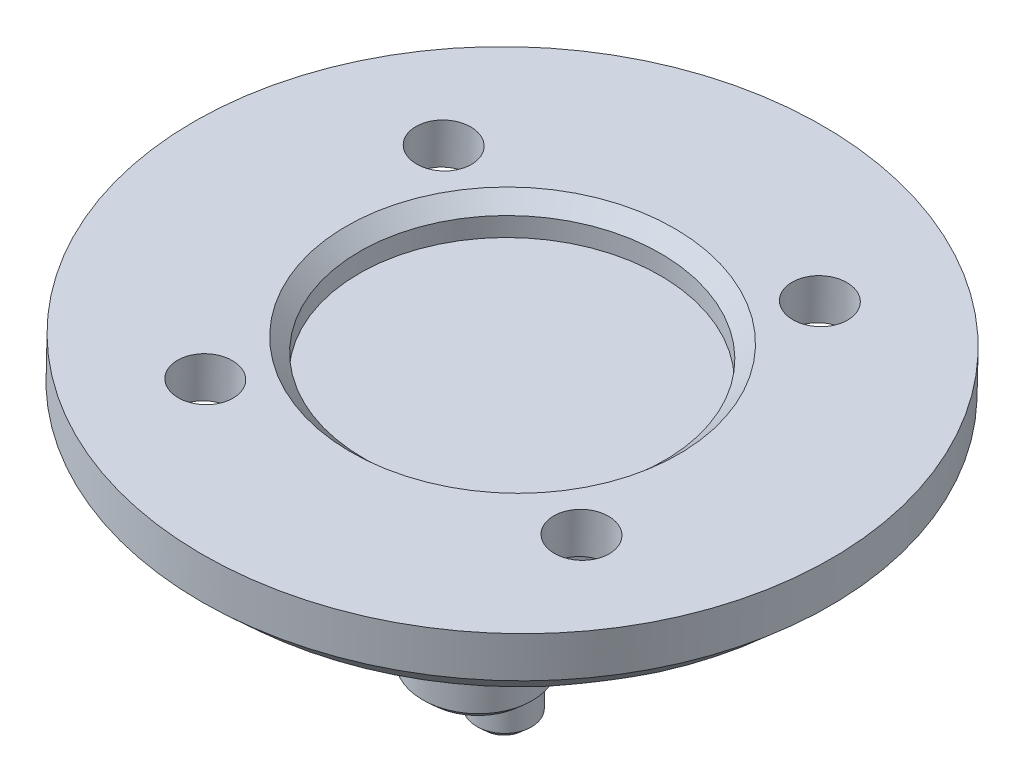
ISO-10303-21;
HEADER;
FILE_DESCRIPTION(('STEP AP214'),'2;1');
FILE_NAME('part.step','',(''),(''),'','','');
FILE_SCHEMA(('AUTOMOTIVE_DESIGN { 1 0 10303 214 1 1 1 1 }'));
ENDSEC;
DATA;
#1=APPLICATION_CONTEXT('core data for automotive mechanical design processes');
#2=APPLICATION_PROTOCOL_DEFINITION('international standard','automotive_design',2000,#1);
#3=PRODUCT_CONTEXT('',#1,'mechanical');
#4=PRODUCT('Part','Part','',(#3));
#5=PRODUCT_RELATED_PRODUCT_CATEGORY('part','',(#4));
#6=PRODUCT_DEFINITION_FORMATION('','',#4);
#7=PRODUCT_DEFINITION_CONTEXT('part definition',#1,'design');
#8=PRODUCT_DEFINITION('design','',#6,#7);
#9=PRODUCT_DEFINITION_SHAPE('','',#8);
#10=(LENGTH_UNIT() NAMED_UNIT(*) SI_UNIT(.MILLI.,.METRE.));
#11=(NAMED_UNIT(*) PLANE_ANGLE_UNIT() SI_UNIT($,.RADIAN.));
#12=(NAMED_UNIT(*) SI_UNIT($,.STERADIAN.) SOLID_ANGLE_UNIT());
#13=UNCERTAINTY_MEASURE_WITH_UNIT(LENGTH_MEASURE(1.E-05),#10,'distance_accuracy_value','');
#14=(GEOMETRIC_REPRESENTATION_CONTEXT(3) GLOBAL_UNCERTAINTY_ASSIGNED_CONTEXT((#13)) GLOBAL_UNIT_ASSIGNED_CONTEXT((#10,
#11,#12)) REPRESENTATION_CONTEXT('',''));
#15=CARTESIAN_POINT('',(0.,0.,0.));
#16=DIRECTION('',(0.,0.,1.));
#17=DIRECTION('',(1.,0.,0.));
#18=AXIS2_PLACEMENT_3D('',#15,#16,#17);
#19=CARTESIAN_POINT('',(-133.548619993604,39.5282636262361,-33.4947766806938));
#20=DIRECTION('',(0.0599731403615461,0.997627727298565,0.0337955642100255));
#21=DIRECTION('',(-0.998197931130778,0.0600074185933236,0.));
#22=AXIS2_PLACEMENT_3D('',#19,#20,#21);
#23=CYLINDRICAL_SURFACE('',#22,0.999999999999998);
#24=CARTESIAN_POINT('',(-133.3986871427,42.0223329444825,-33.4102877701687));
#25=DIRECTION('',(-0.0599731403615461,-0.997627727298565,-0.0337955642100255));
#26=DIRECTION('',(0.998197931130778,-0.0600074185933236,0.));
#27=AXIS2_PLACEMENT_3D('',#24,#25,#26);
#28=CIRCLE('',#27,0.999999999999998);
#29=CARTESIAN_POINT('',(-132.400489211569,41.9623255258892,-33.4102877701687));
#30=VERTEX_POINT('',#29);
#31=EDGE_CURVE('E277',#30,#30,#28,.T.);
#32=ORIENTED_EDGE('',*,*,#31,.F.);
#33=EDGE_LOOP('',(#32));
#34=FACE_BOUND('',#33,.T.);
#35=CARTESIAN_POINT('',(-133.488646853242,40.5258913535347,-33.4609811164837));
#36=DIRECTION('',(-0.0599731403615461,-0.997627727298565,-0.0337955642100256));
#37=DIRECTION('',(0.998197931130778,-0.0600074185933236,0.));
#38=AXIS2_PLACEMENT_3D('',#35,#36,#37);
#39=CIRCLE('',#38,0.999999999999998);
#40=CARTESIAN_POINT('',(-132.490448922111,40.4658839349414,-33.4609811164837));
#41=VERTEX_POINT('',#40);
#42=EDGE_CURVE('E280',#41,#41,#39,.T.);
#43=ORIENTED_EDGE('',*,*,#42,.T.);
#44=EDGE_LOOP('',(#43));
#45=FACE_BOUND('',#44,.T.);
#46=ADVANCED_FACE('F44',(#34,#45),#23,.F.);
#47=CARTESIAN_POINT('',(-131.150275607105,39.0208215939743,-22.7714168160039));
#48=DIRECTION('',(0.0599731403615461,0.997627727298565,0.0337955642100255));
#49=DIRECTION('',(-0.998197931130778,0.0600074185933236,0.));
#50=AXIS2_PLACEMENT_3D('',#47,#48,#49);
#51=CYLINDRICAL_SURFACE('',#50,1.00000000000002);
#52=CARTESIAN_POINT('',(-131.000342756201,41.5148909122207,-22.6869279054788));
#53=DIRECTION('',(-0.0599731403615461,-0.997627727298565,-0.0337955642100255));
#54=DIRECTION('',(0.998197931130778,-0.0600074185933236,0.));
#55=AXIS2_PLACEMENT_3D('',#52,#53,#54);
#56=CIRCLE('',#55,1.00000000000002);
#57=CARTESIAN_POINT('',(-130.00214482507,41.4548834936273,-22.6869279054788));
#58=VERTEX_POINT('',#57);
#59=EDGE_CURVE('E371',#58,#58,#56,.T.);
#60=ORIENTED_EDGE('',*,*,#59,.F.);
#61=EDGE_LOOP('',(#60));
#62=FACE_BOUND('',#61,.T.);
#63=CARTESIAN_POINT('',(-131.090302466743,40.0184493212728,-22.7376212517939));
#64=DIRECTION('',(-0.0599731403615461,-0.997627727298565,-0.0337955642100256));
#65=DIRECTION('',(0.998197931130778,-0.0600074185933236,0.));
#66=AXIS2_PLACEMENT_3D('',#63,#64,#65);
#67=CIRCLE('',#66,1.00000000000002);
#68=CARTESIAN_POINT('',(-130.092104535612,39.9584419026795,-22.7376212517939));
#69=VERTEX_POINT('',#68);
#70=EDGE_CURVE('E358',#69,#69,#67,.T.);
#71=ORIENTED_EDGE('',*,*,#70,.T.);
#72=EDGE_LOOP('',(#71));
#73=FACE_BOUND('',#72,.T.);
#74=ADVANCED_FACE('F218',(#62,#73),#51,.F.);
#75=CARTESIAN_POINT('',(-120.435205186505,38.4587614293735,-25.1945045678125));
#76=DIRECTION('',(0.0599731403615461,0.997627727298565,0.0337955642100255));
#77=DIRECTION('',(-0.998197931130778,0.0600074185933236,0.));
#78=AXIS2_PLACEMENT_3D('',#75,#76,#77);
#79=CYLINDRICAL_SURFACE('',#78,0.999999999999995);
#80=CARTESIAN_POINT('',(-120.285272335601,40.9528307476199,-25.1100156572875));
#81=DIRECTION('',(-0.0599731403615461,-0.997627727298565,-0.0337955642100255));
#82=DIRECTION('',(0.998197931130778,-0.0600074185933236,0.));
#83=AXIS2_PLACEMENT_3D('',#80,#81,#82);
#84=CIRCLE('',#83,0.999999999999995);
#85=CARTESIAN_POINT('',(-119.287074404471,40.8928233290266,-25.1100156572875));
#86=VERTEX_POINT('',#85);
#87=EDGE_CURVE('E353',#86,#86,#84,.T.);
#88=ORIENTED_EDGE('',*,*,#87,.F.);
#89=EDGE_LOOP('',(#88));
#90=FACE_BOUND('',#89,.T.);
#91=CARTESIAN_POINT('',(-120.375232046144,39.4563891566721,-25.1607090036025));
#92=DIRECTION('',(-0.0599731403615461,-0.997627727298565,-0.0337955642100256));
#93=DIRECTION('',(0.998197931130778,-0.0600074185933236,0.));
#94=AXIS2_PLACEMENT_3D('',#91,#92,#93);
#95=CIRCLE('',#94,0.999999999999995);
#96=CARTESIAN_POINT('',(-119.377034115013,39.3963817380788,-25.1607090036025));
#97=VERTEX_POINT('',#96);
#98=EDGE_CURVE('E356',#97,#97,#95,.T.);
#99=ORIENTED_EDGE('',*,*,#98,.T.);
#100=EDGE_LOOP('',(#99));
#101=FACE_BOUND('',#100,.T.);
#102=ADVANCED_FACE('F224',(#90,#101),#79,.F.);
#103=CARTESIAN_POINT('',(-122.833549573004,38.9662034616354,-35.9178644325024));
#104=DIRECTION('',(0.0599731403615461,0.997627727298565,0.0337955642100255));
#105=DIRECTION('',(-0.998197931130778,0.0600074185933236,0.));
#106=AXIS2_PLACEMENT_3D('',#103,#104,#105);
#107=CYLINDRICAL_SURFACE('',#106,1.00000000000001);
#108=CARTESIAN_POINT('',(-122.683616722101,41.4602727798818,-35.8333755219774));
#109=DIRECTION('',(-0.0599731403615461,-0.997627727298565,-0.0337955642100255));
#110=DIRECTION('',(0.998197931130778,-0.0600074185933236,0.));
#111=AXIS2_PLACEMENT_3D('',#108,#109,#110);
#112=CIRCLE('',#111,1.00000000000001);
#113=CARTESIAN_POINT('',(-121.68541879097,41.4002653612885,-35.8333755219774));
#114=VERTEX_POINT('',#113);
#115=EDGE_CURVE('E377',#114,#114,#112,.T.);
#116=ORIENTED_EDGE('',*,*,#115,.F.);
#117=EDGE_LOOP('',(#116));
#118=FACE_BOUND('',#117,.T.);
#119=CARTESIAN_POINT('',(-122.773576432643,39.963831188934,-35.8840688682924));
#120=DIRECTION('',(-0.0599731403615461,-0.997627727298565,-0.0337955642100256));
#121=DIRECTION('',(0.998197931130778,-0.0600074185933236,0.));
#122=AXIS2_PLACEMENT_3D('',#119,#120,#121);
#123=CIRCLE('',#122,1.00000000000001);
#124=CARTESIAN_POINT('',(-121.775378501512,39.9038237703407,-35.8840688682924));
#125=VERTEX_POINT('',#124);
#126=EDGE_CURVE('E359',#125,#125,#123,.T.);
#127=ORIENTED_EDGE('',*,*,#126,.T.);
#128=EDGE_LOOP('',(#127));
#129=FACE_BOUND('',#128,.T.);
#130=ADVANCED_FACE('F235',(#118,#129),#107,.F.);
#131=CARTESIAN_POINT('',(-126.991912590055,38.9935125278048,-29.3446406242531));
#132=DIRECTION('',(0.0599731403615461,0.997627727298565,0.0337955642100255));
#133=DIRECTION('',(-0.998197931130778,0.0600074185933236,0.));
#134=AXIS2_PLACEMENT_3D('',#131,#132,#133);
#135=CYLINDRICAL_SURFACE('',#134,5.49999999999998);
#136=CARTESIAN_POINT('',(-126.871966309331,40.988767982402,-29.2770494958331));
#137=DIRECTION('',(-0.0599731403615472,-0.997627727298565,-0.0337955642100224));
#138=DIRECTION('',(0.998197931130778,-0.0600074185933247,0.));
#139=AXIS2_PLACEMENT_3D('',#136,#137,#138);
#140=CIRCLE('',#139,5.49999999999998);
#141=CARTESIAN_POINT('',(-121.381877688112,40.6587271801387,-29.2770494958331));
#142=VERTEX_POINT('',#141);
#143=EDGE_CURVE('E11',#142,#142,#140,.F.);
#144=ORIENTED_EDGE('',*,*,#143,.T.);
#145=EDGE_LOOP('',(#144));
#146=FACE_BOUND('',#145,.T.);
#147=CARTESIAN_POINT('',(-126.913947507584,40.290428573293,-29.3007063907801));
#148=DIRECTION('',(-0.0599731403615461,-0.997627727298565,-0.0337955642100255));
#149=DIRECTION('',(0.998197931130778,-0.0600074185933236,0.));
#150=AXIS2_PLACEMENT_3D('',#147,#148,#149);
#151=CIRCLE('',#150,5.49999999999995);
#152=CARTESIAN_POINT('',(-121.423858886365,39.9603877710297,-29.3007063907801));
#153=VERTEX_POINT('',#152);
#154=EDGE_CURVE('E381',#153,#153,#151,.T.);
#155=ORIENTED_EDGE('',*,*,#154,.T.);
#156=EDGE_LOOP('',(#155));
#157=FACE_BOUND('',#156,.T.);
#158=ADVANCED_FACE('F231',(#146,#157),#135,.F.);
#159=CARTESIAN_POINT('',(-126.991912590055,38.9935125278048,-29.3446406242531));
#160=DIRECTION('',(-0.0599731403615461,-0.997627727298565,-0.0337955642100255));
#161=DIRECTION('',(0.998197931130778,-0.0600074185933236,0.));
#162=AXIS2_PLACEMENT_3D('',#159,#160,#161);
#163=PLANE('',#162);
#164=CARTESIAN_POINT('',(-126.991912590055,38.9935125278048,-29.3446406242531));
#165=DIRECTION('',(-0.0599731403615461,-0.997627727298565,-0.0337955642100255));
#166=DIRECTION('',(0.998197931130778,-0.0600074185933236,0.));
#167=AXIS2_PLACEMENT_3D('',#164,#165,#166);
#168=CIRCLE('',#167,10.5000000000001);
#169=CARTESIAN_POINT('',(-133.783336535661,39.1305485588551,-21.3379070882078));
#170=VERTEX_POINT('',#169);
#171=CARTESIAN_POINT('',(-136.538513882599,39.7134893575336,-33.6567209952387));
#172=VERTEX_POINT('',#171);
#173=EDGE_CURVE('E503',#170,#172,#168,.T.);
#174=ORIENTED_EDGE('',*,*,#173,.T.);
#175=CARTESIAN_POINT('',(-133.548619993604,39.5282636262361,-33.4947766806938));
#176=DIRECTION('',(-0.0599731403615461,-0.997627727298565,-0.0337955642100255));
#177=DIRECTION('',(0.998197931130778,-0.0600074185933236,0.));
#178=AXIS2_PLACEMENT_3D('',#175,#176,#177);
#179=CIRCLE('',#178,3.00000000000001);
#180=CARTESIAN_POINT('',(-134.975020760718,39.7032214860308,-36.1281719413547));
#181=VERTEX_POINT('',#180);
#182=EDGE_CURVE('E453',#172,#181,#179,.F.);
#183=ORIENTED_EDGE('',*,*,#182,.T.);
#184=CARTESIAN_POINT('',(-122.665729626441,39.0575363034352,-38.9117740466265));
#185=VERTEX_POINT('',#184);
#186=EDGE_CURVE('E431',#181,#185,#168,.T.);
#187=ORIENTED_EDGE('',*,*,#186,.T.);
#188=CARTESIAN_POINT('',(-122.833549573005,38.9662034616354,-35.9178644325024));
#189=DIRECTION('',(-0.0599731403615461,-0.997627727298565,-0.0337955642100255));
#190=DIRECTION('',(0.998197931130778,-0.0600074185933236,0.));
#191=AXIS2_PLACEMENT_3D('',#188,#189,#190);
#192=CIRCLE('',#191,3.00000000000002);
#193=CARTESIAN_POINT('',(-120.200488644448,38.8564764967546,-37.3513741602986));
#194=VERTEX_POINT('',#193);
#195=EDGE_CURVE('E443',#185,#194,#192,.F.);
#196=ORIENTED_EDGE('',*,*,#195,.T.);
#197=CARTESIAN_POINT('',(-117.44531129751,38.2735356980761,-25.0325602532675));
#198=VERTEX_POINT('',#197);
#199=EDGE_CURVE('E427',#194,#198,#168,.T.);
#200=ORIENTED_EDGE('',*,*,#199,.T.);
#201=CARTESIAN_POINT('',(-120.435205186505,38.4587614293735,-25.1945045678126));
#202=DIRECTION('',(-0.0599731403615461,-0.997627727298565,-0.0337955642100255));
#203=DIRECTION('',(0.998197931130778,-0.0600074185933236,0.));
#204=AXIS2_PLACEMENT_3D('',#201,#202,#203);
#205=CIRCLE('',#204,2.99999999999999);
#206=CARTESIAN_POINT('',(-119.008804419391,38.2838035695788,-22.5611093071517));
#207=VERTEX_POINT('',#206);
#208=EDGE_CURVE('E446',#198,#207,#205,.F.);
#209=ORIENTED_EDGE('',*,*,#208,.T.);
#210=CARTESIAN_POINT('',(-131.318095553668,38.9294887521745,-19.7775072018799));
#211=VERTEX_POINT('',#210);
#212=EDGE_CURVE('E433',#207,#211,#168,.T.);
#213=ORIENTED_EDGE('',*,*,#212,.T.);
#214=CARTESIAN_POINT('',(-131.150275607105,39.0208215939743,-22.7714168160039));
#215=DIRECTION('',(-0.0599731403615461,-0.997627727298565,-0.0337955642100255));
#216=DIRECTION('',(0.998197931130778,-0.0600074185933236,0.));
#217=AXIS2_PLACEMENT_3D('',#214,#215,#216);
#218=CIRCLE('',#217,3.00000000000001);
#219=EDGE_CURVE('E450',#211,#170,#218,.F.);
#220=ORIENTED_EDGE('',*,*,#219,.T.);
#221=EDGE_LOOP('',(#174,#183,#187,#196,#200,#209,#213,#220));
#222=FACE_BOUND('',#221,.T.);
#223=CARTESIAN_POINT('',(-126.991912590054,38.9596560215857,-28.3452139200939));
#224=DIRECTION('',(-0.0599731403615461,-0.997627727298565,-0.0337955642100256));
#225=DIRECTION('',(0.998197931130778,-0.0600074185933236,0.));
#226=AXIS2_PLACEMENT_3D('',#223,#224,#225);
#227=CIRCLE('',#226,2.99999999999998);
#228=CARTESIAN_POINT('',(-123.997318796662,38.7796337658058,-28.3452139200939));
#229=VERTEX_POINT('',#228);
#230=EDGE_CURVE('E111',#229,#229,#227,.T.);
#231=ORIENTED_EDGE('',*,*,#230,.F.);
#232=EDGE_LOOP('',(#231));
#233=FACE_BOUND('',#232,.T.);
#234=ADVANCED_FACE('F234',(#222,#233),#163,.T.);
#235=CARTESIAN_POINT('',(-126.841979739151,41.4875818460512,-29.2601517137281));
#236=DIRECTION('',(-0.0599731403615461,-0.997627727298565,-0.0337955642100255));
#237=DIRECTION('',(0.998197931130778,-0.0600074185933236,0.));
#238=AXIS2_PLACEMENT_3D('',#235,#236,#237);
#239=PLANE('',#238);
#240=CARTESIAN_POINT('',(-126.841979739151,41.4875818460512,-29.2601517137281));
#241=DIRECTION('',(-0.0599731403615461,-0.997627727298565,-0.0337955642100255));
#242=DIRECTION('',(0.998197931130778,-0.0600074185933236,0.));
#243=AXIS2_PLACEMENT_3D('',#240,#241,#242);
#244=CIRCLE('',#243,5.99999999999999);
#245=CARTESIAN_POINT('',(-120.852792152366,41.1275373344913,-29.2601517137281));
#246=VERTEX_POINT('',#245);
#247=EDGE_CURVE('E54',#246,#246,#244,.T.);
#248=ORIENTED_EDGE('',*,*,#247,.T.);
#249=EDGE_LOOP('',(#248));
#250=FACE_BOUND('',#249,.T.);
#251=CARTESIAN_POINT('',(-126.841979739151,41.4875818460512,-29.2601517137281));
#252=DIRECTION('',(-0.0599731403615461,-0.997627727298565,-0.0337955642100255));
#253=DIRECTION('',(0.998197931130778,-0.0600074185933236,0.));
#254=AXIS2_PLACEMENT_3D('',#251,#252,#253);
#255=CIRCLE('',#254,11.5);
#256=CARTESIAN_POINT('',(-115.362703531147,40.797496532228,-29.2601517137281));
#257=VERTEX_POINT('',#256);
#258=EDGE_CURVE('E270',#257,#257,#255,.T.);
#259=ORIENTED_EDGE('',*,*,#258,.F.);
#260=EDGE_LOOP('',(#259));
#261=FACE_BOUND('',#260,.T.);
#262=ORIENTED_EDGE('',*,*,#31,.T.);
#263=EDGE_LOOP('',(#262));
#264=FACE_BOUND('',#263,.T.);
#265=ORIENTED_EDGE('',*,*,#59,.T.);
#266=EDGE_LOOP('',(#265));
#267=FACE_BOUND('',#266,.T.);
#268=ORIENTED_EDGE('',*,*,#87,.T.);
#269=EDGE_LOOP('',(#268));
#270=FACE_BOUND('',#269,.T.);
#271=ORIENTED_EDGE('',*,*,#115,.T.);
#272=EDGE_LOOP('',(#271));
#273=FACE_BOUND('',#272,.T.);
#274=ADVANCED_FACE('F239',(#250,#261,#264,#267,#270,#273),#239,.F.);
#275=CARTESIAN_POINT('',(-126.991912590055,38.9935125278048,-29.3446406242531));
#276=DIRECTION('',(0.0599731403615461,0.997627727298565,0.0337955642100255));
#277=DIRECTION('',(-0.998197931130778,0.0600074185933236,0.));
#278=AXIS2_PLACEMENT_3D('',#275,#276,#277);
#279=CYLINDRICAL_SURFACE('',#278,11.5);
#280=CARTESIAN_POINT('',(-126.931939449693,39.9911402551034,-29.3108450600431));
#281=DIRECTION('',(-0.0599731403615481,-0.997627727298565,-0.0337955642100264));
#282=DIRECTION('',(0.998197931130778,-0.0600074185933256,0.));
#283=AXIS2_PLACEMENT_3D('',#280,#281,#282);
#284=CIRCLE('',#283,11.5);
#285=CARTESIAN_POINT('',(-115.452663241689,39.3010549412801,-29.3108450600431));
#286=VERTEX_POINT('',#285);
#287=EDGE_CURVE('E435',#286,#286,#284,.F.);
#288=ORIENTED_EDGE('',*,*,#287,.T.);
#289=EDGE_LOOP('',(#288));
#290=FACE_BOUND('',#289,.T.);
#291=ORIENTED_EDGE('',*,*,#258,.T.);
#292=EDGE_LOOP('',(#291));
#293=FACE_BOUND('',#292,.T.);
#294=ADVANCED_FACE('F243',(#290,#293),#279,.T.);
#295=CARTESIAN_POINT('',(-126.913947507584,40.290428573293,-29.3007063907801));
#296=DIRECTION('',(-0.0599731403615461,-0.997627727298565,-0.0337955642100255));
#297=DIRECTION('',(0.998197931130778,-0.0600074185933236,0.));
#298=AXIS2_PLACEMENT_3D('',#295,#296,#297);
#299=PLANE('',#298);
#300=ORIENTED_EDGE('',*,*,#154,.F.);
#301=EDGE_LOOP('',(#300));
#302=FACE_BOUND('',#301,.T.);
#303=ADVANCED_FACE('F246',(#302),#299,.F.);
#304=CARTESIAN_POINT('',(-122.773576432643,39.963831188934,-35.8840688682924));
#305=DIRECTION('',(-0.0599731403615461,-0.997627727298565,-0.0337955642100256));
#306=DIRECTION('',(0.998197931130778,-0.0600074185933236,0.));
#307=AXIS2_PLACEMENT_3D('',#304,#305,#306);
#308=CYLINDRICAL_SURFACE('',#307,2.5);
#309=CARTESIAN_POINT('',(-122.803563002824,39.4650173252847,-35.9009666503974));
#310=DIRECTION('',(-0.0599731403615472,-0.997627727298565,-0.0337955642100294));
#311=DIRECTION('',(0.998197931130778,-0.0600074185933247,0.));
#312=AXIS2_PLACEMENT_3D('',#309,#310,#311);
#313=CIRCLE('',#312,2.5);
#314=CARTESIAN_POINT('',(-120.308068174997,39.3149987788014,-35.9009666503974));
#315=VERTEX_POINT('',#314);
#316=EDGE_CURVE('E469',#315,#315,#313,.T.);
#317=ORIENTED_EDGE('',*,*,#316,.T.);
#318=EDGE_LOOP('',(#317));
#319=FACE_BOUND('',#318,.T.);
#320=CARTESIAN_POINT('',(-122.773576432643,39.963831188934,-35.8840688682924));
#321=DIRECTION('',(-0.0599731403615461,-0.997627727298565,-0.0337955642100256));
#322=DIRECTION('',(0.998197931130778,-0.0600074185933236,0.));
#323=AXIS2_PLACEMENT_3D('',#320,#321,#322);
#324=CIRCLE('',#323,2.5);
#325=CARTESIAN_POINT('',(-120.278081604816,39.8138126424507,-35.8840688682924));
#326=VERTEX_POINT('',#325);
#327=EDGE_CURVE('E389',#326,#326,#324,.T.);
#328=ORIENTED_EDGE('',*,*,#327,.F.);
#329=EDGE_LOOP('',(#328));
#330=FACE_BOUND('',#329,.T.);
#331=ADVANCED_FACE('F328',(#319,#330),#308,.F.);
#332=CARTESIAN_POINT('',(-122.773576432643,39.963831188934,-35.8840688682924));
#333=DIRECTION('',(-0.0599731403615461,-0.997627727298565,-0.0337955642100256));
#334=DIRECTION('',(0.998197931130778,-0.0600074185933236,0.));
#335=AXIS2_PLACEMENT_3D('',#332,#333,#334);
#336=PLANE('',#335);
#337=ORIENTED_EDGE('',*,*,#126,.F.);
#338=EDGE_LOOP('',(#337));
#339=FACE_BOUND('',#338,.T.);
#340=ORIENTED_EDGE('',*,*,#327,.T.);
#341=EDGE_LOOP('',(#340));
#342=FACE_BOUND('',#341,.T.);
#343=ADVANCED_FACE('F323',(#339,#342),#336,.T.);
#344=CARTESIAN_POINT('',(-120.375232046144,39.4563891566721,-25.1607090036025));
#345=DIRECTION('',(-0.0599731403615461,-0.997627727298565,-0.0337955642100256));
#346=DIRECTION('',(0.998197931130778,-0.0600074185933236,0.));
#347=AXIS2_PLACEMENT_3D('',#344,#345,#346);
#348=CYLINDRICAL_SURFACE('',#347,2.49999999999999);
#349=CARTESIAN_POINT('',(-120.405218616324,38.9575752930228,-25.1776067857076));
#350=DIRECTION('',(-0.0599731403615456,-0.997627727298566,-0.0337955642100215));
#351=DIRECTION('',(0.998197931130778,-0.0600074185933231,0.));
#352=AXIS2_PLACEMENT_3D('',#349,#350,#351);
#353=CIRCLE('',#352,2.49999999999999);
#354=CARTESIAN_POINT('',(-117.909723788498,38.8075567465395,-25.1776067857076));
#355=VERTEX_POINT('',#354);
#356=EDGE_CURVE('E467',#355,#355,#353,.T.);
#357=ORIENTED_EDGE('',*,*,#356,.T.);
#358=EDGE_LOOP('',(#357));
#359=FACE_BOUND('',#358,.T.);
#360=CARTESIAN_POINT('',(-120.375232046144,39.4563891566721,-25.1607090036025));
#361=DIRECTION('',(-0.0599731403615461,-0.997627727298565,-0.0337955642100256));
#362=DIRECTION('',(0.998197931130778,-0.0600074185933236,0.));
#363=AXIS2_PLACEMENT_3D('',#360,#361,#362);
#364=CIRCLE('',#363,2.49999999999999);
#365=CARTESIAN_POINT('',(-117.879737218317,39.3063706101888,-25.1607090036025));
#366=VERTEX_POINT('',#365);
#367=EDGE_CURVE('E393',#366,#366,#364,.T.);
#368=ORIENTED_EDGE('',*,*,#367,.F.);
#369=EDGE_LOOP('',(#368));
#370=FACE_BOUND('',#369,.T.);
#371=ADVANCED_FACE('F320',(#359,#370),#348,.F.);
#372=CARTESIAN_POINT('',(-120.375232046144,39.4563891566721,-25.1607090036025));
#373=DIRECTION('',(-0.0599731403615461,-0.997627727298565,-0.0337955642100256));
#374=DIRECTION('',(0.998197931130778,-0.0600074185933236,0.));
#375=AXIS2_PLACEMENT_3D('',#372,#373,#374);
#376=PLANE('',#375);
#377=ORIENTED_EDGE('',*,*,#98,.F.);
#378=EDGE_LOOP('',(#377));
#379=FACE_BOUND('',#378,.T.);
#380=ORIENTED_EDGE('',*,*,#367,.T.);
#381=EDGE_LOOP('',(#380));
#382=FACE_BOUND('',#381,.T.);
#383=ADVANCED_FACE('F314',(#379,#382),#376,.T.);
#384=CARTESIAN_POINT('',(-131.090302466743,40.0184493212728,-22.7376212517938));
#385=DIRECTION('',(-0.0599731403615461,-0.997627727298565,-0.0337955642100256));
#386=DIRECTION('',(0.998197931130778,-0.0600074185933236,0.));
#387=AXIS2_PLACEMENT_3D('',#384,#385,#386);
#388=CYLINDRICAL_SURFACE('',#387,2.50000000000001);
#389=CARTESIAN_POINT('',(-131.120289036924,39.5196354576235,-22.7545190338989));
#390=DIRECTION('',(-0.0599731403615472,-0.997627727298565,-0.0337955642100224));
#391=DIRECTION('',(0.998197931130778,-0.0600074185933247,0.));
#392=AXIS2_PLACEMENT_3D('',#389,#390,#391);
#393=CIRCLE('',#392,2.50000000000001);
#394=CARTESIAN_POINT('',(-128.624794209097,39.3696169111402,-22.7545190338989));
#395=VERTEX_POINT('',#394);
#396=EDGE_CURVE('E470',#395,#395,#393,.T.);
#397=ORIENTED_EDGE('',*,*,#396,.T.);
#398=EDGE_LOOP('',(#397));
#399=FACE_BOUND('',#398,.T.);
#400=CARTESIAN_POINT('',(-131.090302466743,40.0184493212728,-22.7376212517938));
#401=DIRECTION('',(-0.0599731403615461,-0.997627727298565,-0.0337955642100256));
#402=DIRECTION('',(0.998197931130778,-0.0600074185933236,0.));
#403=AXIS2_PLACEMENT_3D('',#400,#401,#402);
#404=CIRCLE('',#403,2.50000000000001);
#405=CARTESIAN_POINT('',(-128.594807638916,39.8684307747895,-22.7376212517938));
#406=VERTEX_POINT('',#405);
#407=EDGE_CURVE('E388',#406,#406,#404,.T.);
#408=ORIENTED_EDGE('',*,*,#407,.F.);
#409=EDGE_LOOP('',(#408));
#410=FACE_BOUND('',#409,.T.);
#411=ADVANCED_FACE('F310',(#399,#410),#388,.F.);
#412=CARTESIAN_POINT('',(-131.090302466743,40.0184493212728,-22.7376212517938));
#413=DIRECTION('',(-0.0599731403615461,-0.997627727298565,-0.0337955642100256));
#414=DIRECTION('',(0.998197931130778,-0.0600074185933236,0.));
#415=AXIS2_PLACEMENT_3D('',#412,#413,#414);
#416=PLANE('',#415);
#417=ORIENTED_EDGE('',*,*,#70,.F.);
#418=EDGE_LOOP('',(#417));
#419=FACE_BOUND('',#418,.T.);
#420=ORIENTED_EDGE('',*,*,#407,.T.);
#421=EDGE_LOOP('',(#420));
#422=FACE_BOUND('',#421,.T.);
#423=ADVANCED_FACE('F313',(#419,#422),#416,.T.);
#424=CARTESIAN_POINT('',(-133.488646853242,40.5258913535347,-33.4609811164837));
#425=DIRECTION('',(-0.0599731403615461,-0.997627727298565,-0.0337955642100256));
#426=DIRECTION('',(0.998197931130778,-0.0600074185933236,0.));
#427=AXIS2_PLACEMENT_3D('',#424,#425,#426);
#428=CYLINDRICAL_SURFACE('',#427,2.49999999999998);
#429=CARTESIAN_POINT('',(-133.518633423423,40.0270774898854,-33.4778788985887));
#430=DIRECTION('',(-0.0599731403615464,-0.997627727298565,-0.0337955642100289));
#431=DIRECTION('',(0.998197931130778,-0.0600074185933239,0.));
#432=AXIS2_PLACEMENT_3D('',#429,#430,#431);
#433=CIRCLE('',#432,2.49999999999998);
#434=CARTESIAN_POINT('',(-131.023138595596,39.8770589434021,-33.4778788985887));
#435=VERTEX_POINT('',#434);
#436=EDGE_CURVE('E439',#435,#435,#433,.T.);
#437=ORIENTED_EDGE('',*,*,#436,.T.);
#438=EDGE_LOOP('',(#437));
#439=FACE_BOUND('',#438,.T.);
#440=CARTESIAN_POINT('',(-133.488646853242,40.5258913535347,-33.4609811164837));
#441=DIRECTION('',(-0.0599731403615461,-0.997627727298565,-0.0337955642100256));
#442=DIRECTION('',(0.998197931130778,-0.0600074185933236,0.));
#443=AXIS2_PLACEMENT_3D('',#440,#441,#442);
#444=CIRCLE('',#443,2.49999999999998);
#445=CARTESIAN_POINT('',(-130.993152025415,40.3758728070514,-33.4609811164837));
#446=VERTEX_POINT('',#445);
#447=EDGE_CURVE('E365',#446,#446,#444,.T.);
#448=ORIENTED_EDGE('',*,*,#447,.F.);
#449=EDGE_LOOP('',(#448));
#450=FACE_BOUND('',#449,.T.);
#451=ADVANCED_FACE('F318',(#439,#450),#428,.F.);
#452=CARTESIAN_POINT('',(-133.488646853242,40.5258913535347,-33.4609811164837));
#453=DIRECTION('',(-0.0599731403615461,-0.997627727298565,-0.0337955642100256));
#454=DIRECTION('',(0.998197931130778,-0.0600074185933236,0.));
#455=AXIS2_PLACEMENT_3D('',#452,#453,#454);
#456=PLANE('',#455);
#457=ORIENTED_EDGE('',*,*,#42,.F.);
#458=EDGE_LOOP('',(#457));
#459=FACE_BOUND('',#458,.T.);
#460=ORIENTED_EDGE('',*,*,#447,.T.);
#461=EDGE_LOOP('',(#460));
#462=FACE_BOUND('',#461,.T.);
#463=ADVANCED_FACE('F303',(#459,#462),#456,.T.);
#464=CARTESIAN_POINT('',(-127.231805151501,34.9691451123915,-28.480396176934));
#465=DIRECTION('',(0.0599731403615461,0.997627727298565,0.0337955642100256));
#466=DIRECTION('',(-0.998197931130778,0.0600074185933236,0.));
#467=AXIS2_PLACEMENT_3D('',#464,#465,#466);
#468=CYLINDRICAL_SURFACE('',#467,2.99999999999998);
#469=CARTESIAN_POINT('',(-127.213813209392,35.268433430581,-28.470257507671));
#470=DIRECTION('',(-0.0599731403615643,-0.997627727298564,-0.0337955642100309));
#471=DIRECTION('',(0.998197931130777,-0.0600074185933418,0.));
#472=AXIS2_PLACEMENT_3D('',#469,#470,#471);
#473=CIRCLE('',#472,2.99999999999998);
#474=CARTESIAN_POINT('',(-124.219219416,35.088411174801,-28.470257507671));
#475=VERTEX_POINT('',#474);
#476=EDGE_CURVE('E120',#475,#475,#473,.F.);
#477=ORIENTED_EDGE('',*,*,#476,.T.);
#478=EDGE_LOOP('',(#477));
#479=FACE_BOUND('',#478,.T.);
#480=ORIENTED_EDGE('',*,*,#230,.T.);
#481=EDGE_LOOP('',(#480));
#482=FACE_BOUND('',#481,.T.);
#483=ADVANCED_FACE('F289',(#479,#482),#468,.T.);
#484=CARTESIAN_POINT('',(-127.231805151501,34.9691451123915,-28.480396176934));
#485=DIRECTION('',(-0.0599731403615461,-0.997627727298565,-0.0337955642100256));
#486=DIRECTION('',(0.998197931130778,-0.0600074185933236,0.));
#487=AXIS2_PLACEMENT_3D('',#484,#485,#486);
#488=PLANE('',#487);
#489=CARTESIAN_POINT('',(-127.231805151505,34.9691451123917,-28.4803961769332));
#490=DIRECTION('',(-0.0599731403615461,-0.997627727298565,-0.0337955642100256));
#491=DIRECTION('',(0.998197931130778,-0.0600074185933236,0.));
#492=AXIS2_PLACEMENT_3D('',#489,#490,#491);
#493=CIRCLE('',#492,2.30042505215082);
#494=CARTESIAN_POINT('',(-124.935525623726,34.8311025433447,-28.4803961769332));
#495=VERTEX_POINT('',#494);
#496=EDGE_CURVE('E406',#495,#495,#493,.T.);
#497=ORIENTED_EDGE('',*,*,#496,.F.);
#498=EDGE_LOOP('',(#497));
#499=FACE_BOUND('',#498,.T.);
#500=CARTESIAN_POINT('',(-127.231805151501,34.9691451123915,-28.480396176934));
#501=DIRECTION('',(-0.0599731403615461,-0.997627727298565,-0.0337955642100256));
#502=DIRECTION('',(0.998197931130778,-0.0600074185933236,0.));
#503=AXIS2_PLACEMENT_3D('',#500,#501,#502);
#504=CIRCLE('',#503,2.70000000000004);
#505=CARTESIAN_POINT('',(-124.536670737447,34.8071250821895,-28.480396176934));
#506=VERTEX_POINT('',#505);
#507=EDGE_CURVE('E274',#506,#506,#504,.T.);
#508=ORIENTED_EDGE('',*,*,#507,.T.);
#509=EDGE_LOOP('',(#508));
#510=FACE_BOUND('',#509,.T.);
#511=ADVANCED_FACE('F295',(#499,#510),#488,.T.);
#512=CARTESIAN_POINT('',(-127.231805151501,34.9691451123915,-28.480396176934));
#513=DIRECTION('',(0.0599731403615643,0.997627727298564,0.0337955642100309));
#514=DIRECTION('',(-0.998197931130777,0.0600074185933418,0.));
#515=AXIS2_PLACEMENT_3D('',#512,#513,#514);
#516=CONICAL_SURFACE('',#515,2.69999999999998,0.785398163397428);
#517=ORIENTED_EDGE('',*,*,#476,.F.);
#518=EDGE_LOOP('',(#517));
#519=FACE_BOUND('',#518,.T.);
#520=ORIENTED_EDGE('',*,*,#507,.F.);
#521=EDGE_LOOP('',(#520));
#522=FACE_BOUND('',#521,.T.);
#523=ADVANCED_FACE('F148',(#519,#522),#516,.T.);
#524=CARTESIAN_POINT('',(-127.711985174489,26.9815542986373,-28.7509832214219));
#525=DIRECTION('',(0.0599731403615461,0.997627727298565,0.0337955642100256));
#526=DIRECTION('',(-0.998197931130778,0.0600074185933236,0.));
#527=AXIS2_PLACEMENT_3D('',#524,#525,#526);
#528=CYLINDRICAL_SURFACE('',#527,2.30042505215082);
#529=CARTESIAN_POINT('',(-127.321764862042,33.4727035215223,-28.5310895232456));
#530=DIRECTION('',(0.0599731403615678,0.997627727298564,0.0337955642100203));
#531=DIRECTION('',(-0.998197931130777,0.0600074185933453,0.));
#532=AXIS2_PLACEMENT_3D('',#529,#530,#531);
#533=CIRCLE('',#532,2.30042505215082);
#534=CARTESIAN_POINT('',(-129.618044389821,33.6107460905693,-28.5310895232456));
#535=VERTEX_POINT('',#534);
#536=EDGE_CURVE('E112',#535,#535,#533,.T.);
#537=ORIENTED_EDGE('',*,*,#536,.T.);
#538=EDGE_LOOP('',(#537));
#539=FACE_BOUND('',#538,.T.);
#540=ORIENTED_EDGE('',*,*,#496,.T.);
#541=EDGE_LOOP('',(#540));
#542=FACE_BOUND('',#541,.T.);
#543=ADVANCED_FACE('F294',(#539,#542),#528,.T.);
#544=CARTESIAN_POINT('',(-127.321764862042,33.4727035215223,-28.5310895232456));
#545=DIRECTION('',(0.0599731403615678,0.997627727298564,0.0337955642100203));
#546=DIRECTION('',(-0.669139725860026,0.015056563154377,0.742984069265249));
#547=AXIS2_PLACEMENT_3D('',#544,#545,#546);
#548=PLANE('',#547);
#549=CARTESIAN_POINT('',(-127.321764862038,33.4727035215221,-28.5310895232464));
#550=DIRECTION('',(0.0599731403615678,0.997627727298564,0.0337955642100203));
#551=DIRECTION('',(-0.998197931130777,0.0600074185933453,0.));
#552=AXIS2_PLACEMENT_3D('',#549,#550,#551);
#553=CIRCLE('',#552,1.99999999999999);
#554=CARTESIAN_POINT('',(-129.3181607243,33.5927183587088,-28.5310895232464));
#555=VERTEX_POINT('',#554);
#556=EDGE_CURVE('E424',#555,#555,#553,.T.);
#557=ORIENTED_EDGE('',*,*,#556,.T.);
#558=EDGE_LOOP('',(#557));
#559=FACE_BOUND('',#558,.T.);
#560=ORIENTED_EDGE('',*,*,#536,.F.);
#561=EDGE_LOOP('',(#560));
#562=FACE_BOUND('',#561,.T.);
#563=ADVANCED_FACE('F260',(#559,#562),#548,.F.);
#564=CARTESIAN_POINT('',(-127.561657423504,29.5160491184694,-29.6656984842514));
#565=DIRECTION('',(-0.0599731403615461,-0.997627727298565,-0.0337955642100256));
#566=DIRECTION('',(0.998197931130778,-0.0600074185933236,0.));
#567=AXIS2_PLACEMENT_3D('',#564,#565,#566);
#568=PLANE('',#567);
#569=CARTESIAN_POINT('',(-127.561657423504,29.5160491184694,-29.6656984842514));
#570=DIRECTION('',(-0.0599731403615461,-0.997627727298565,-0.0337955642100256));
#571=DIRECTION('',(0.998197931130778,-0.0600074185933236,0.));
#572=AXIS2_PLACEMENT_3D('',#569,#570,#571);
#573=CIRCLE('',#572,0.699999999996986);
#574=CARTESIAN_POINT('',(-126.862918871715,29.4740439254543,-29.6656984842514));
#575=VERTEX_POINT('',#574);
#576=EDGE_CURVE('E268',#575,#575,#573,.T.);
#577=ORIENTED_EDGE('',*,*,#576,.T.);
#578=EDGE_LOOP('',(#577));
#579=FACE_BOUND('',#578,.T.);
#580=ADVANCED_FACE('F253',(#579),#568,.T.);
#581=CARTESIAN_POINT('',(-127.561657423504,29.5160491184694,-29.6656984842514));
#582=DIRECTION('',(0.059973140361565,0.997627727298564,0.0337955642100312));
#583=DIRECTION('',(-0.998197931130777,0.0600074185933425,0.));
#584=AXIS2_PLACEMENT_3D('',#581,#582,#583);
#585=CONICAL_SURFACE('',#584,0.699999999996986,0.785398163397424);
#586=CARTESIAN_POINT('',(-127.543665481395,29.815337436659,-29.6555598149884));
#587=DIRECTION('',(-0.059973140361565,-0.997627727298564,-0.0337955642100312));
#588=DIRECTION('',(0.998197931130777,-0.0600074185933425,0.));
#589=AXIS2_PLACEMENT_3D('',#586,#587,#588);
#590=CIRCLE('',#589,0.999999999996973);
#591=CARTESIAN_POINT('',(-126.545467550267,29.7553300180658,-29.6555598149884));
#592=VERTEX_POINT('',#591);
#593=EDGE_CURVE('E265',#592,#592,#590,.F.);
#594=ORIENTED_EDGE('',*,*,#593,.F.);
#595=EDGE_LOOP('',(#594));
#596=FACE_BOUND('',#595,.T.);
#597=ORIENTED_EDGE('',*,*,#576,.F.);
#598=EDGE_LOOP('',(#597));
#599=FACE_BOUND('',#598,.T.);
#600=ADVANCED_FACE('F249',(#596,#599),#585,.T.);
#601=CARTESIAN_POINT('',(-127.441711142767,31.4774480668465,-28.5986806516667));
#602=DIRECTION('',(0.0599731403615461,0.997627727298565,0.0337955642100255));
#603=DIRECTION('',(0.829521878189014,-0.0309776255057683,-0.557614419042222));
#604=AXIS2_PLACEMENT_3D('',#601,#602,#603);
#605=PLANE('',#604);
#606=CARTESIAN_POINT('',(-127.44171114278,31.5113045730666,-29.5981073558313));
#607=DIRECTION('',(-0.0599731403615461,-0.997627727298565,-0.0337955642100256));
#608=DIRECTION('',(0.998197931130778,-0.0600074185933236,0.));
#609=AXIS2_PLACEMENT_3D('',#606,#607,#608);
#610=CIRCLE('',#609,0.999999999996973);
#611=CARTESIAN_POINT('',(-126.5477925367,31.4726937282699,-30.0446705969988));
#612=VERTEX_POINT('',#611);
#613=CARTESIAN_POINT('',(-128.335629748873,31.5800477083989,-30.0410338813631));
#614=VERTEX_POINT('',#613);
#615=EDGE_CURVE('E99',#612,#614,#610,.T.);
#616=ORIENTED_EDGE('',*,*,#615,.F.);
#617=CARTESIAN_POINT('',(-127.441711142766,31.4774480668465,-28.5986806516691));
#618=DIRECTION('',(0.0599731403615461,0.997627727298565,0.0337955642100255));
#619=DIRECTION('',(-0.998197931130778,0.0600074185933236,0.));
#620=AXIS2_PLACEMENT_3D('',#617,#618,#619);
#621=CIRCLE('',#620,1.70000000000001);
#622=EDGE_CURVE('E105',#612,#614,#621,.F.);
#623=ORIENTED_EDGE('',*,*,#622,.T.);
#624=EDGE_LOOP('',(#616,#623));
#625=FACE_BOUND('',#624,.T.);
#626=ADVANCED_FACE('F109',(#625),#605,.F.);
#627=CARTESIAN_POINT('',(-127.561657423504,29.5160491184694,-29.6656984842514));
#628=DIRECTION('',(0.0599731403615461,0.997627727298565,0.0337955642100256));
#629=DIRECTION('',(-0.998197931130778,0.0600074185933236,0.));
#630=AXIS2_PLACEMENT_3D('',#627,#628,#629);
#631=CYLINDRICAL_SURFACE('',#630,0.999999999996973);
#632=ORIENTED_EDGE('',*,*,#593,.T.);
#633=EDGE_LOOP('',(#632));
#634=FACE_BOUND('',#633,.T.);
#635=ORIENTED_EDGE('',*,*,#615,.T.);
#636=CARTESIAN_POINT('',(-128.335629748873,31.5800477083989,-30.0410338813631));
#637=CARTESIAN_POINT('',(-128.322763407442,31.5943567995366,-30.0647781616893));
#638=CARTESIAN_POINT('',(-128.308857531276,31.6082228534039,-30.0882145489553));
#639=CARTESIAN_POINT('',(-128.278957531305,31.6350176871712,-30.1342994679553));
#640=CARTESIAN_POINT('',(-128.262962199395,31.6479459180522,-30.1569475342203));
#641=CARTESIAN_POINT('',(-128.211737812071,31.6853063961133,-30.2235589402868));
#642=CARTESIAN_POINT('',(-128.173356952244,31.7082172416824,-30.2660270544759));
#643=CARTESIAN_POINT('',(-128.088652887766,31.7494168161975,-30.345234431051));
#644=CARTESIAN_POINT('',(-128.042301525933,31.767688569781,-30.3819524702485));
#645=CARTESIAN_POINT('',(-127.942861764739,31.7989168530489,-30.4476142572852));
#646=CARTESIAN_POINT('',(-127.88978575403,31.8118829759333,-30.4765720036184));
#647=CARTESIAN_POINT('',(-127.783599127766,31.8311433807222,-30.5229201580561));
#648=CARTESIAN_POINT('',(-127.730933014555,31.8379382407412,-30.5411245818191));
#649=CARTESIAN_POINT('',(-127.62300423051,31.8465408815472,-30.5688539919929));
#650=CARTESIAN_POINT('',(-127.567746561154,31.8483578964515,-30.5783950273414));
#651=CARTESIAN_POINT('',(-127.497472584297,31.8474790024642,-30.5846744454921));
#652=CARTESIAN_POINT('',(-127.482716243694,31.8471178567473,-30.5856688949327));
#653=CARTESIAN_POINT('',(-127.453211953291,31.8460451697461,-30.5870132792374));
#654=CARTESIAN_POINT('',(-127.438464031479,31.8453342218562,-30.5873643008457));
#655=CARTESIAN_POINT('',(-127.423719200686,31.8444493974759,-30.5873953907245));
#656=B_SPLINE_CURVE_WITH_KNOTS('',3,(#636,#637,#638,#639,#640,#641,#642,#643,#644,#645,#646,
#647,#648,#649,#650,#651,#652,#653,#654,#655),.UNSPECIFIED.,.F.,.F.,(4,2,2,2,2,2,2,2,2,4),(0.,
0.0916443342123103,0.183341892836826,0.367354194713376,0.552030432959947,0.73637126358706,
0.903902300581162,1.07112234916753,1.11549364896365,1.15978993671235),.UNSPECIFIED.);
#657=CARTESIAN_POINT('',(-127.423719200686,31.8444493974759,-30.5873953907245));
#658=VERTEX_POINT('',#657);
#659=EDGE_CURVE('E100',#614,#658,#656,.T.);
#660=ORIENTED_EDGE('',*,*,#659,.T.);
#661=CARTESIAN_POINT('',(-127.423719200686,31.8444493974759,-30.5873953907245));
#662=CARTESIAN_POINT('',(-127.397904816268,31.8428993249347,-30.5874490476433));
#663=CARTESIAN_POINT('',(-127.372133589593,31.840815337097,-30.5865139854081));
#664=CARTESIAN_POINT('',(-127.320849741558,31.8355963522018,-30.5826877362572));
#665=CARTESIAN_POINT('',(-127.295337063868,31.8324615893747,-30.5797969851422));
#666=CARTESIAN_POINT('',(-127.219621485552,31.821532903413,-30.5682520406119));
#667=CARTESIAN_POINT('',(-127.17004105072,31.8122024458574,-30.5567251870454));
#668=CARTESIAN_POINT('',(-127.074082895271,31.7897229490501,-30.5265391424626));
#669=CARTESIAN_POINT('',(-127.027703983218,31.7765753399266,-30.5078826218101));
#670=CARTESIAN_POINT('',(-126.939232951041,31.7468057653394,-30.4642382540258));
#671=CARTESIAN_POINT('',(-126.897142176542,31.7301827142404,-30.4392484280197));
#672=CARTESIAN_POINT('',(-126.816761127579,31.6932262490658,-30.3829564600977));
#673=CARTESIAN_POINT('',(-126.778655181893,31.6727834299064,-30.3514641687615));
#674=CARTESIAN_POINT('',(-126.708615010384,31.6290359335986,-30.2839074205368));
#675=CARTESIAN_POINT('',(-126.676684191925,31.6057296879773,-30.2478404574687));
#676=CARTESIAN_POINT('',(-126.628118490185,31.5641848300529,-30.1838626573978));
#677=CARTESIAN_POINT('',(-126.609787028168,31.5465649636256,-30.1568137483466));
#678=CARTESIAN_POINT('',(-126.57637478641,31.5103443651708,-30.1015464426658));
#679=CARTESIAN_POINT('',(-126.561283989136,31.491746883699,-30.0733319811307));
#680=CARTESIAN_POINT('',(-126.5477925367,31.4726937282699,-30.0446705969988));
#681=B_SPLINE_CURVE_WITH_KNOTS('',3,(#661,#662,#663,#664,#665,#666,#667,#668,#669,#670,#671,
#672,#673,#674,#675,#676,#677,#678,#679,#680),.UNSPECIFIED.,.F.,.F.,(4,2,2,2,2,2,2,2,2,4),(0.,
0.0775327642879148,0.15504825706556,0.3094861945381,0.463866345030955,0.618294792005251,
0.778122512871811,0.938038174733746,1.049244113072,1.16010117929251),.UNSPECIFIED.);
#682=EDGE_CURVE('E96',#658,#612,#681,.T.);
#683=ORIENTED_EDGE('',*,*,#682,.T.);
#684=EDGE_LOOP('',(#635,#660,#683));
#685=FACE_BOUND('',#684,.T.);
#686=ADVANCED_FACE('F98',(#634,#685),#631,.T.);
#687=CARTESIAN_POINT('',(-127.423719200658,31.7767363850361,-28.5885419824061));
#688=DIRECTION('',(0.0599731403615643,0.997627727298564,0.0337955642100193));
#689=DIRECTION('',(-0.998197931130777,0.0600074185933418,0.));
#690=AXIS2_PLACEMENT_3D('',#687,#688,#689);
#691=CONICAL_SURFACE('',#690,1.99999999999999,0.785398163397436);
#692=ORIENTED_EDGE('',*,*,#659,.F.);
#693=ORIENTED_EDGE('',*,*,#622,.F.);
#694=ORIENTED_EDGE('',*,*,#682,.F.);
#695=CARTESIAN_POINT('',(-127.423719200658,31.7767363850361,-28.5885419824061));
#696=DIRECTION('',(0.0599731403615643,0.997627727298564,0.0337955642100193));
#697=DIRECTION('',(-0.998197931130777,0.0600074185933418,0.));
#698=AXIS2_PLACEMENT_3D('',#695,#696,#697);
#699=CIRCLE('',#698,1.99999999999999);
#700=EDGE_CURVE('E116',#658,#658,#699,.T.);
#701=ORIENTED_EDGE('',*,*,#700,.F.);
#702=EDGE_LOOP('',(#692,#693,#694,#701));
#703=FACE_BOUND('',#702,.T.);
#704=ADVANCED_FACE('F114',(#703),#691,.T.);
#705=CARTESIAN_POINT('',(-127.780970456676,25.8340134182662,-28.7898572326846));
#706=DIRECTION('',(0.0599731403615461,0.997627727298565,0.0337955642100256));
#707=DIRECTION('',(-0.998197931130778,0.0600074185933236,0.));
#708=AXIS2_PLACEMENT_3D('',#705,#706,#707);
#709=CYLINDRICAL_SURFACE('',#708,1.99999999999999);
#710=ORIENTED_EDGE('',*,*,#700,.T.);
#711=EDGE_LOOP('',(#710));
#712=FACE_BOUND('',#711,.T.);
#713=ORIENTED_EDGE('',*,*,#556,.F.);
#714=EDGE_LOOP('',(#713));
#715=FACE_BOUND('',#714,.T.);
#716=ADVANCED_FACE('F147',(#712,#715),#709,.T.);
#717=CARTESIAN_POINT('',(-126.991912590055,38.9935125278048,-29.3446406242531));
#718=DIRECTION('',(0.0599731403615481,0.997627727298565,0.0337955642100264));
#719=DIRECTION('',(-0.998197931130778,0.0600074185933256,0.));
#720=AXIS2_PLACEMENT_3D('',#717,#718,#719);
#721=CONICAL_SURFACE('',#720,10.5,0.785398163397433);
#722=ORIENTED_EDGE('',*,*,#287,.F.);
#723=EDGE_LOOP('',(#722));
#724=FACE_BOUND('',#723,.T.);
#725=ORIENTED_EDGE('',*,*,#186,.F.);
#726=CARTESIAN_POINT('',(-134.975020760718,39.7032214860308,-36.1281719413547));
#727=CARTESIAN_POINT('',(-135.062249890696,39.7270200713743,-36.0554971493337));
#728=CARTESIAN_POINT('',(-135.147331480614,39.7483767331868,-35.9794004868886));
#729=CARTESIAN_POINT('',(-135.312484775334,39.7859182408962,-35.8206979868892));
#730=CARTESIAN_POINT('',(-135.392554148359,39.8021006938233,-35.7380891595385));
#731=CARTESIAN_POINT('',(-135.546858372031,39.8289784295873,-35.5667956459493));
#732=CARTESIAN_POINT('',(-135.621095319684,39.8396756922984,-35.4781131651104));
#733=CARTESIAN_POINT('',(-135.763053715607,39.8553949637809,-35.2952332586091));
#734=CARTESIAN_POINT('',(-135.830776727712,39.8604183378395,-35.2010371654076));
#735=CARTESIAN_POINT('',(-135.958176324159,39.8646680422244,-35.0092362903242));
#736=CARTESIAN_POINT('',(-136.017957245696,39.8639791471245,-34.9117026760507));
#737=CARTESIAN_POINT('',(-136.130189490985,39.8570236576908,-34.7126962830178));
#738=CARTESIAN_POINT('',(-136.18264074487,39.8507570101944,-34.6112234667221));
#739=CARTESIAN_POINT('',(-136.279813473866,39.8327888378547,-34.4053796157453));
#740=CARTESIAN_POINT('',(-136.324550859962,39.8210986882708,-34.3010150748879));
#741=CARTESIAN_POINT('',(-136.40627403701,39.7925054460126,-34.0900457891088));
#742=CARTESIAN_POINT('',(-136.443264013171,39.7756051801437,-33.9834422881158));
#743=CARTESIAN_POINT('',(-136.487632798999,39.7496767109559,-33.8396905777509));
#744=CARTESIAN_POINT('',(-136.498433406873,39.7428212646465,-33.8031707598601));
#745=CARTESIAN_POINT('',(-136.519139201999,39.7285635135261,-33.7300276444294));
#746=CARTESIAN_POINT('',(-136.529045328565,39.7211617975707,-33.6934044980895));
#747=CARTESIAN_POINT('',(-136.538513882599,39.7134893575336,-33.6567209952387));
#748=B_SPLINE_CURVE_WITH_KNOTS('',3,(#726,#727,#728,#729,#730,#731,#732,#733,#734,#735,#736,
#737,#738,#739,#740,#741,#742,#743,#744,#745,#746,#747),.UNSPECIFIED.,.F.,.F.,(4,2,2,2,2,2,2,2,
2,2,4),(0.,0.347958967341592,0.696078626869498,1.0440725443316,1.39198270743027,1.7347389558204,
2.07749847110869,2.41954230988675,2.76140089469524,2.877477493307,2.99343074413075),.UNSPECIFIED.);
#749=EDGE_CURVE('E186',#181,#172,#748,.T.);
#750=ORIENTED_EDGE('',*,*,#749,.T.);
#751=ORIENTED_EDGE('',*,*,#173,.F.);
#752=CARTESIAN_POINT('',(-133.783336535661,39.1305485588551,-21.3379070882078));
#753=CARTESIAN_POINT('',(-133.710380989284,39.1441591360534,-21.2487490284632));
#754=CARTESIAN_POINT('',(-133.634060606553,39.1554505776958,-21.1619539335131));
#755=CARTESIAN_POINT('',(-133.475029544908,39.1731842952603,-20.9938286952002));
#756=CARTESIAN_POINT('',(-133.392315931146,39.1796243293635,-20.9125010941374));
#757=CARTESIAN_POINT('',(-133.220936818278,39.187429957865,-20.7561618931768));
#758=CARTESIAN_POINT('',(-133.132273479805,39.1887973843289,-20.6811480225275));
#759=CARTESIAN_POINT('',(-132.949558085313,39.1863490908039,-20.5381325256568));
#760=CARTESIAN_POINT('',(-132.855507331373,39.1825346182034,-20.4701292160902));
#761=CARTESIAN_POINT('',(-132.664120298913,39.1697999548148,-20.3426728510085));
#762=CARTESIAN_POINT('',(-132.566853331564,39.1609562368427,-20.2831080561656));
#763=CARTESIAN_POINT('',(-132.368500447311,39.1383003444201,-20.1717938880173));
#764=CARTESIAN_POINT('',(-132.267414494016,39.1244881226148,-20.1200445892081));
#765=CARTESIAN_POINT('',(-132.062459066606,39.0921021680108,-20.0247476418151));
#766=CARTESIAN_POINT('',(-131.958595845142,39.0735384373895,-19.9811830939242));
#767=CARTESIAN_POINT('',(-131.748737811813,39.0318896682453,-19.9022573276143));
#768=CARTESIAN_POINT('',(-131.642744184903,39.0088070839483,-19.8668916789787));
#769=CARTESIAN_POINT('',(-131.499876773294,38.9750728002872,-19.8249830914448));
#770=CARTESIAN_POINT('',(-131.463586902059,38.9662796908046,-19.8148305624641));
#771=CARTESIAN_POINT('',(-131.390914732685,38.9482303227503,-19.7954681022637));
#772=CARTESIAN_POINT('',(-131.354532573741,38.9389745662692,-19.786257180865));
#773=CARTESIAN_POINT('',(-131.318095553668,38.9294887521745,-19.7775072018799));
#774=B_SPLINE_CURVE_WITH_KNOTS('',3,(#752,#753,#754,#755,#756,#757,#758,#759,#760,#761,#762,
#763,#764,#765,#766,#767,#768,#769,#770,#771,#772,#773),.UNSPECIFIED.,.F.,.F.,(4,2,2,2,2,2,2,2,
2,2,4),(0.,0.347958967341574,0.696078626869477,1.04407254433158,1.39198270743023,
1.73473895582035,2.07749847110865,2.41954230988671,2.76140089469519,2.87747749330694,
2.99343074413068),.UNSPECIFIED.);
#775=EDGE_CURVE('E180',#170,#211,#774,.T.);
#776=ORIENTED_EDGE('',*,*,#775,.T.);
#777=ORIENTED_EDGE('',*,*,#212,.F.);
#778=CARTESIAN_POINT('',(-119.008804419391,38.2838035695788,-22.5611093071517));
#779=CARTESIAN_POINT('',(-118.919060398613,38.3018391249635,-22.6323669288691));
#780=CARTESIAN_POINT('',(-118.831726803181,38.317943618742,-22.7071945599365));
#781=CARTESIAN_POINT('',(-118.662625941084,38.3460682183305,-22.8636725596691));
#782=CARTESIAN_POINT('',(-118.580861263651,38.3580864344799,-22.9453260632086));
#783=CARTESIAN_POINT('',(-118.423756435078,38.3777955721839,-23.1150414032662));
#784=CARTESIAN_POINT('',(-118.348413974044,38.3854880552047,-23.2031009144184));
#785=CARTESIAN_POINT('',(-118.204854436822,38.3964030894453,-23.3850785591195));
#786=CARTESIAN_POINT('',(-118.136635650077,38.3996267160321,-23.4789952775279));
#787=CARTESIAN_POINT('',(-118.008866488603,38.4015245689598,-23.6705878984076));
#788=CARTESIAN_POINT('',(-117.949202671451,38.4002654823377,-23.768187502368));
#789=CARTESIAN_POINT('',(-117.837803378233,38.3933651677148,-23.9676632736097));
#790=CARTESIAN_POINT('',(-117.78606797774,38.3877238979469,-24.0695394816431));
#791=CARTESIAN_POINT('',(-117.690909949427,38.3721783798175,-24.2765186399566));
#792=CARTESIAN_POINT('',(-117.647470190217,38.3622830570828,-24.3816144087018));
#793=CARTESIAN_POINT('',(-117.568901214222,38.3384075039833,-24.5943611235699));
#794=CARTESIAN_POINT('',(-117.533767509118,38.3244294889434,-24.7020106549574));
#795=CARTESIAN_POINT('',(-117.492237818776,38.3031308101156,-24.8473622287479));
#796=CARTESIAN_POINT('',(-117.482187201631,38.2975104790621,-24.8843046751637));
#797=CARTESIAN_POINT('',(-117.463039965273,38.2858422667878,-24.9583260566416));
#798=CARTESIAN_POINT('',(-117.453942343652,38.2797948462459,-24.9954048049496));
#799=CARTESIAN_POINT('',(-117.44531129751,38.2735356980761,-25.0325602532676));
#800=B_SPLINE_CURVE_WITH_KNOTS('',3,(#778,#779,#780,#781,#782,#783,#784,#785,#786,#787,#788,
#789,#790,#791,#792,#793,#794,#795,#796,#797,#798,#799),.UNSPECIFIED.,.F.,.F.,(4,2,2,2,2,2,2,2,
2,2,4),(0.,0.347958967341572,0.696078626869453,1.04407254433155,1.39198270743021,
1.73473895582033,2.07749847110862,2.41954230988666,2.76140089469515,2.87747749330686,
2.99343074413057),.UNSPECIFIED.);
#801=EDGE_CURVE('E173',#207,#198,#800,.T.);
#802=ORIENTED_EDGE('',*,*,#801,.T.);
#803=ORIENTED_EDGE('',*,*,#199,.F.);
#804=CARTESIAN_POINT('',(-120.200488644448,38.8564764967546,-37.3513741602986));
#805=CARTESIAN_POINT('',(-120.270929300024,38.8847000602844,-37.4391150497396));
#806=CARTESIAN_POINT('',(-120.344997677242,38.9108697742329,-37.524641113312));
#807=CARTESIAN_POINT('',(-120.50008117151,38.9588021639663,-37.690541851358));
#808=CARTESIAN_POINT('',(-120.581099480864,38.9805627989397,-37.7709141286097));
#809=CARTESIAN_POINT('',(-120.749677988832,39.0193440439062,-37.9256751560387));
#810=CARTESIAN_POINT('',(-120.837235813923,39.0363663631743,-38.0000660570013));
#811=CARTESIAN_POINT('',(-121.018350067116,39.0654489624222,-38.1421792920717));
#812=CARTESIAN_POINT('',(-121.111905046416,39.0775104356682,-38.2099032268453));
#813=CARTESIAN_POINT('',(-121.302922513849,39.0963926563694,-38.3371513377233));
#814=CARTESIAN_POINT('',(-121.400306585583,39.1032883926195,-38.3967821222531));
#815=CARTESIAN_POINT('',(-121.599492421907,39.1120884809855,-38.5085656686102));
#816=CARTESIAN_POINT('',(-121.701294228595,39.1139927855266,-38.5607183591571));
#817=CARTESIAN_POINT('',(-121.908264356687,39.1128650496614,-38.6571506138869));
#818=CARTESIAN_POINT('',(-122.013425205037,39.1098433079641,-38.7014463896655));
#819=CARTESIAN_POINT('',(-122.22643743942,39.0990232817507,-38.7821495850644));
#820=CARTESIAN_POINT('',(-122.334287337386,39.0912275851388,-38.8185612640945));
#821=CARTESIAN_POINT('',(-122.479993844481,39.0777347207843,-38.862069715054));
#822=CARTESIAN_POINT('',(-122.517033706445,39.0740520529041,-38.8726448725597));
#823=CARTESIAN_POINT('',(-122.591264434587,39.0661754575637,-38.8928855988073));
#824=CARTESIAN_POINT('',(-122.628455098476,39.0619820775474,-38.9025521221742));
#825=CARTESIAN_POINT('',(-122.665729626441,39.0575363034352,-38.9117740466264));
#826=B_SPLINE_CURVE_WITH_KNOTS('',3,(#804,#805,#806,#807,#808,#809,#810,#811,#812,#813,#814,
#815,#816,#817,#818,#819,#820,#821,#822,#823,#824,#825),.UNSPECIFIED.,.F.,.F.,(4,2,2,2,2,2,2,2,
2,2,4),(0.,0.347958967341567,0.696078626869464,1.04407254433154,1.39198270743024,
1.73473895582037,2.07749847110866,2.41954230988671,2.76140089469521,2.87747749330695,
2.99343074413067),.UNSPECIFIED.);
#827=EDGE_CURVE('E60',#194,#185,#826,.T.);
#828=ORIENTED_EDGE('',*,*,#827,.T.);
#829=EDGE_LOOP('',(#725,#750,#751,#776,#777,#802,#803,#828));
#830=FACE_BOUND('',#829,.T.);
#831=ADVANCED_FACE('F150',(#724,#830),#721,.T.);
#832=CARTESIAN_POINT('',(-133.518633423423,40.0270774898854,-33.4778788985887));
#833=DIRECTION('',(-0.0599731403615464,-0.997627727298565,-0.0337955642100289));
#834=DIRECTION('',(0.998197931130778,-0.0600074185933239,0.));
#835=AXIS2_PLACEMENT_3D('',#832,#833,#834);
#836=CONICAL_SURFACE('',#835,2.49999999999998,0.785398163397474);
#837=ORIENTED_EDGE('',*,*,#749,.F.);
#838=ORIENTED_EDGE('',*,*,#182,.F.);
#839=EDGE_LOOP('',(#837,#838));
#840=FACE_BOUND('',#839,.T.);
#841=ORIENTED_EDGE('',*,*,#436,.F.);
#842=EDGE_LOOP('',(#841));
#843=FACE_BOUND('',#842,.T.);
#844=ADVANCED_FACE('F158',(#840,#843),#836,.F.);
#845=CARTESIAN_POINT('',(-131.120289036924,39.5196354576235,-22.7545190338989));
#846=DIRECTION('',(-0.0599731403615472,-0.997627727298565,-0.0337955642100224));
#847=DIRECTION('',(0.998197931130778,-0.0600074185933247,0.));
#848=AXIS2_PLACEMENT_3D('',#845,#846,#847);
#849=CONICAL_SURFACE('',#848,2.50000000000001,0.785398163397455);
#850=ORIENTED_EDGE('',*,*,#775,.F.);
#851=ORIENTED_EDGE('',*,*,#219,.F.);
#852=EDGE_LOOP('',(#850,#851));
#853=FACE_BOUND('',#852,.T.);
#854=ORIENTED_EDGE('',*,*,#396,.F.);
#855=EDGE_LOOP('',(#854));
#856=FACE_BOUND('',#855,.T.);
#857=ADVANCED_FACE('F193',(#853,#856),#849,.F.);
#858=CARTESIAN_POINT('',(-120.405218616324,38.9575752930228,-25.1776067857076));
#859=DIRECTION('',(-0.0599731403615456,-0.997627727298566,-0.0337955642100215));
#860=DIRECTION('',(0.998197931130778,-0.0600074185933231,0.));
#861=AXIS2_PLACEMENT_3D('',#858,#859,#860);
#862=CONICAL_SURFACE('',#861,2.49999999999999,0.785398163397441);
#863=ORIENTED_EDGE('',*,*,#801,.F.);
#864=ORIENTED_EDGE('',*,*,#208,.F.);
#865=EDGE_LOOP('',(#863,#864));
#866=FACE_BOUND('',#865,.T.);
#867=ORIENTED_EDGE('',*,*,#356,.F.);
#868=EDGE_LOOP('',(#867));
#869=FACE_BOUND('',#868,.T.);
#870=ADVANCED_FACE('F199',(#866,#869),#862,.F.);
#871=CARTESIAN_POINT('',(-122.803563002824,39.4650173252847,-35.9009666503974));
#872=DIRECTION('',(-0.0599731403615472,-0.997627727298565,-0.0337955642100294));
#873=DIRECTION('',(0.998197931130778,-0.0600074185933247,0.));
#874=AXIS2_PLACEMENT_3D('',#871,#872,#873);
#875=CONICAL_SURFACE('',#874,2.5,0.78539816339747);
#876=ORIENTED_EDGE('',*,*,#827,.F.);
#877=ORIENTED_EDGE('',*,*,#195,.F.);
#878=EDGE_LOOP('',(#876,#877));
#879=FACE_BOUND('',#878,.T.);
#880=ORIENTED_EDGE('',*,*,#316,.F.);
#881=EDGE_LOOP('',(#880));
#882=FACE_BOUND('',#881,.T.);
#883=ADVANCED_FACE('F206',(#879,#882),#875,.F.);
#884=CARTESIAN_POINT('',(-126.841979739151,41.4875818460512,-29.2601517137281));
#885=DIRECTION('',(0.0599731403615472,0.997627727298565,0.0337955642100224));
#886=DIRECTION('',(-0.998197931130778,0.0600074185933247,0.));
#887=AXIS2_PLACEMENT_3D('',#884,#885,#886);
#888=CONICAL_SURFACE('',#887,5.99999999999998,0.785398163397457);
#889=ORIENTED_EDGE('',*,*,#143,.F.);
#890=EDGE_LOOP('',(#889));
#891=FACE_BOUND('',#890,.T.);
#892=ORIENTED_EDGE('',*,*,#247,.F.);
#893=EDGE_LOOP('',(#892));
#894=FACE_BOUND('',#893,.T.);
#895=ADVANCED_FACE('F47',(#891,#894),#888,.F.);
#896=CLOSED_SHELL('',(#46,#74,#102,#130,#158,#234,#274,#294,#303,#331,#343,#371,#383,#411,#423,
#451,#463,#483,#511,#523,#543,#563,#580,#600,#626,#686,#704,#716,#831,#844,#857,#870,#883,#895));
#897=MANIFOLD_SOLID_BREP('B2',#896);
#898=ADVANCED_BREP_SHAPE_REPRESENTATION('',(#18,#897),#14);
#899=SHAPE_DEFINITION_REPRESENTATION(#9,#898);
ENDSEC;
END-ISO-10303-21;
